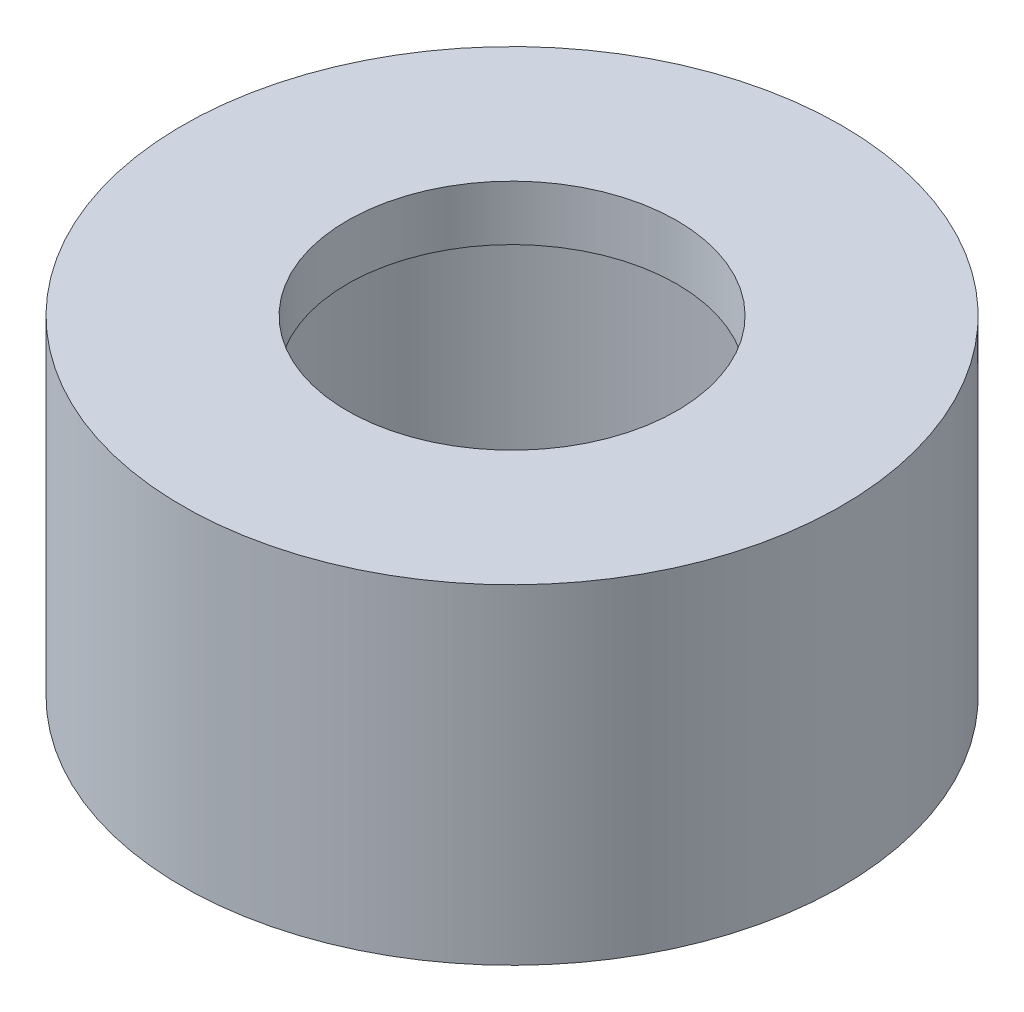
ISO-10303-21;
HEADER;
FILE_DESCRIPTION(('STEP AP214'),'2;1');
FILE_NAME('part.step','',(''),(''),'','','');
FILE_SCHEMA(('AUTOMOTIVE_DESIGN { 1 0 10303 214 1 1 1 1 }'));
ENDSEC;
DATA;
#1=APPLICATION_CONTEXT('core data for automotive mechanical design processes');
#2=APPLICATION_PROTOCOL_DEFINITION('international standard','automotive_design',2000,#1);
#3=PRODUCT_CONTEXT('',#1,'mechanical');
#4=PRODUCT('Part','Part','',(#3));
#5=PRODUCT_RELATED_PRODUCT_CATEGORY('part','',(#4));
#6=PRODUCT_DEFINITION_FORMATION('','',#4);
#7=PRODUCT_DEFINITION_CONTEXT('part definition',#1,'design');
#8=PRODUCT_DEFINITION('design','',#6,#7);
#9=PRODUCT_DEFINITION_SHAPE('','',#8);
#10=(LENGTH_UNIT() NAMED_UNIT(*) SI_UNIT(.MILLI.,.METRE.));
#11=(NAMED_UNIT(*) PLANE_ANGLE_UNIT() SI_UNIT($,.RADIAN.));
#12=(NAMED_UNIT(*) SI_UNIT($,.STERADIAN.) SOLID_ANGLE_UNIT());
#13=UNCERTAINTY_MEASURE_WITH_UNIT(LENGTH_MEASURE(1.E-05),#10,'distance_accuracy_value','');
#14=(GEOMETRIC_REPRESENTATION_CONTEXT(3) GLOBAL_UNCERTAINTY_ASSIGNED_CONTEXT((#13)) GLOBAL_UNIT_ASSIGNED_CONTEXT((#10,
#11,#12)) REPRESENTATION_CONTEXT('',''));
#15=CARTESIAN_POINT('',(0.,0.,0.));
#16=DIRECTION('',(0.,0.,1.));
#17=DIRECTION('',(1.,0.,0.));
#18=AXIS2_PLACEMENT_3D('',#15,#16,#17);
#19=CARTESIAN_POINT('',(0.,0.,0.));
#20=DIRECTION('',(0.,-1.,0.));
#21=DIRECTION('',(0.,0.,-1.));
#22=AXIS2_PLACEMENT_3D('',#19,#20,#21);
#23=CYLINDRICAL_SURFACE('',#22,25.);
#24=CARTESIAN_POINT('',(0.,25.,0.));
#25=DIRECTION('',(0.,-1.,0.));
#26=DIRECTION('',(0.,0.,-1.));
#27=AXIS2_PLACEMENT_3D('',#24,#25,#26);
#28=CIRCLE('',#27,25.);
#29=CARTESIAN_POINT('',(0.,25.,-25.));
#30=VERTEX_POINT('',#29);
#31=EDGE_CURVE('E58',#30,#30,#28,.T.);
#32=ORIENTED_EDGE('',*,*,#31,.F.);
#33=EDGE_LOOP('',(#32));
#34=FACE_BOUND('',#33,.T.);
#35=CARTESIAN_POINT('',(0.,0.,0.));
#36=DIRECTION('',(0.,-1.,0.));
#37=DIRECTION('',(0.,0.,-1.));
#38=AXIS2_PLACEMENT_3D('',#35,#36,#37);
#39=CIRCLE('',#38,25.);
#40=CARTESIAN_POINT('',(0.,0.,-25.));
#41=VERTEX_POINT('',#40);
#42=EDGE_CURVE('E10',#41,#41,#39,.T.);
#43=ORIENTED_EDGE('',*,*,#42,.T.);
#44=EDGE_LOOP('',(#43));
#45=FACE_BOUND('',#44,.T.);
#46=ADVANCED_FACE('F36',(#34,#45),#23,.F.);
#47=CARTESIAN_POINT('',(-25.,0.,0.));
#48=DIRECTION('',(0.,1.,0.));
#49=DIRECTION('',(0.,0.,1.));
#50=AXIS2_PLACEMENT_3D('',#47,#48,#49);
#51=PLANE('',#50);
#52=ORIENTED_EDGE('',*,*,#42,.F.);
#53=EDGE_LOOP('',(#52));
#54=FACE_BOUND('',#53,.T.);
#55=CARTESIAN_POINT('',(0.,0.,0.));
#56=DIRECTION('',(0.,-1.,0.));
#57=DIRECTION('',(0.,0.,-1.));
#58=AXIS2_PLACEMENT_3D('',#55,#56,#57);
#59=CIRCLE('',#58,30.);
#60=CARTESIAN_POINT('',(0.,0.,-30.));
#61=VERTEX_POINT('',#60);
#62=EDGE_CURVE('E42',#61,#61,#59,.T.);
#63=ORIENTED_EDGE('',*,*,#62,.T.);
#64=EDGE_LOOP('',(#63));
#65=FACE_BOUND('',#64,.T.);
#66=ADVANCED_FACE('F65',(#54,#65),#51,.F.);
#67=CARTESIAN_POINT('',(0.,0.,0.));
#68=DIRECTION('',(0.,-1.,0.));
#69=DIRECTION('',(0.,0.,-1.));
#70=AXIS2_PLACEMENT_3D('',#67,#68,#69);
#71=CYLINDRICAL_SURFACE('',#70,30.);
#72=ORIENTED_EDGE('',*,*,#62,.F.);
#73=EDGE_LOOP('',(#72));
#74=FACE_BOUND('',#73,.T.);
#75=CARTESIAN_POINT('',(0.,30.,0.));
#76=DIRECTION('',(0.,-1.,0.));
#77=DIRECTION('',(0.,0.,-1.));
#78=AXIS2_PLACEMENT_3D('',#75,#76,#77);
#79=CIRCLE('',#78,30.);
#80=CARTESIAN_POINT('',(0.,30.,-30.));
#81=VERTEX_POINT('',#80);
#82=EDGE_CURVE('E46',#81,#81,#79,.T.);
#83=ORIENTED_EDGE('',*,*,#82,.T.);
#84=EDGE_LOOP('',(#83));
#85=FACE_BOUND('',#84,.T.);
#86=ADVANCED_FACE('F69',(#74,#85),#71,.T.);
#87=CARTESIAN_POINT('',(-30.,30.,0.));
#88=DIRECTION('',(0.,-1.,0.));
#89=DIRECTION('',(0.,0.,-1.));
#90=AXIS2_PLACEMENT_3D('',#87,#88,#89);
#91=PLANE('',#90);
#92=ORIENTED_EDGE('',*,*,#82,.F.);
#93=EDGE_LOOP('',(#92));
#94=FACE_BOUND('',#93,.T.);
#95=CARTESIAN_POINT('',(0.,30.,0.));
#96=DIRECTION('',(0.,-1.,0.));
#97=DIRECTION('',(0.,0.,-1.));
#98=AXIS2_PLACEMENT_3D('',#95,#96,#97);
#99=CIRCLE('',#98,15.);
#100=CARTESIAN_POINT('',(0.,30.,-15.));
#101=VERTEX_POINT('',#100);
#102=EDGE_CURVE('E50',#101,#101,#99,.T.);
#103=ORIENTED_EDGE('',*,*,#102,.T.);
#104=EDGE_LOOP('',(#103));
#105=FACE_BOUND('',#104,.T.);
#106=ADVANCED_FACE('F74',(#94,#105),#91,.F.);
#107=CARTESIAN_POINT('',(0.,0.,0.));
#108=DIRECTION('',(0.,-1.,0.));
#109=DIRECTION('',(0.,0.,-1.));
#110=AXIS2_PLACEMENT_3D('',#107,#108,#109);
#111=CYLINDRICAL_SURFACE('',#110,15.);
#112=ORIENTED_EDGE('',*,*,#102,.F.);
#113=EDGE_LOOP('',(#112));
#114=FACE_BOUND('',#113,.T.);
#115=CARTESIAN_POINT('',(0.,25.,0.));
#116=DIRECTION('',(0.,-1.,0.));
#117=DIRECTION('',(0.,0.,-1.));
#118=AXIS2_PLACEMENT_3D('',#115,#116,#117);
#119=CIRCLE('',#118,15.);
#120=CARTESIAN_POINT('',(0.,25.,-15.));
#121=VERTEX_POINT('',#120);
#122=EDGE_CURVE('E55',#121,#121,#119,.T.);
#123=ORIENTED_EDGE('',*,*,#122,.T.);
#124=EDGE_LOOP('',(#123));
#125=FACE_BOUND('',#124,.T.);
#126=ADVANCED_FACE('F80',(#114,#125),#111,.F.);
#127=CARTESIAN_POINT('',(-25.,25.,0.));
#128=DIRECTION('',(0.,1.,0.));
#129=DIRECTION('',(0.,0.,1.));
#130=AXIS2_PLACEMENT_3D('',#127,#128,#129);
#131=PLANE('',#130);
#132=ORIENTED_EDGE('',*,*,#122,.F.);
#133=EDGE_LOOP('',(#132));
#134=FACE_BOUND('',#133,.T.);
#135=ORIENTED_EDGE('',*,*,#31,.T.);
#136=EDGE_LOOP('',(#135));
#137=FACE_BOUND('',#136,.T.);
#138=ADVANCED_FACE('F62',(#134,#137),#131,.F.);
#139=CLOSED_SHELL('',(#46,#66,#86,#106,#126,#138));
#140=MANIFOLD_SOLID_BREP('B2',#139);
#141=ADVANCED_BREP_SHAPE_REPRESENTATION('',(#18,#140),#14);
#142=SHAPE_DEFINITION_REPRESENTATION(#9,#141);
ENDSEC;
END-ISO-10303-21;
